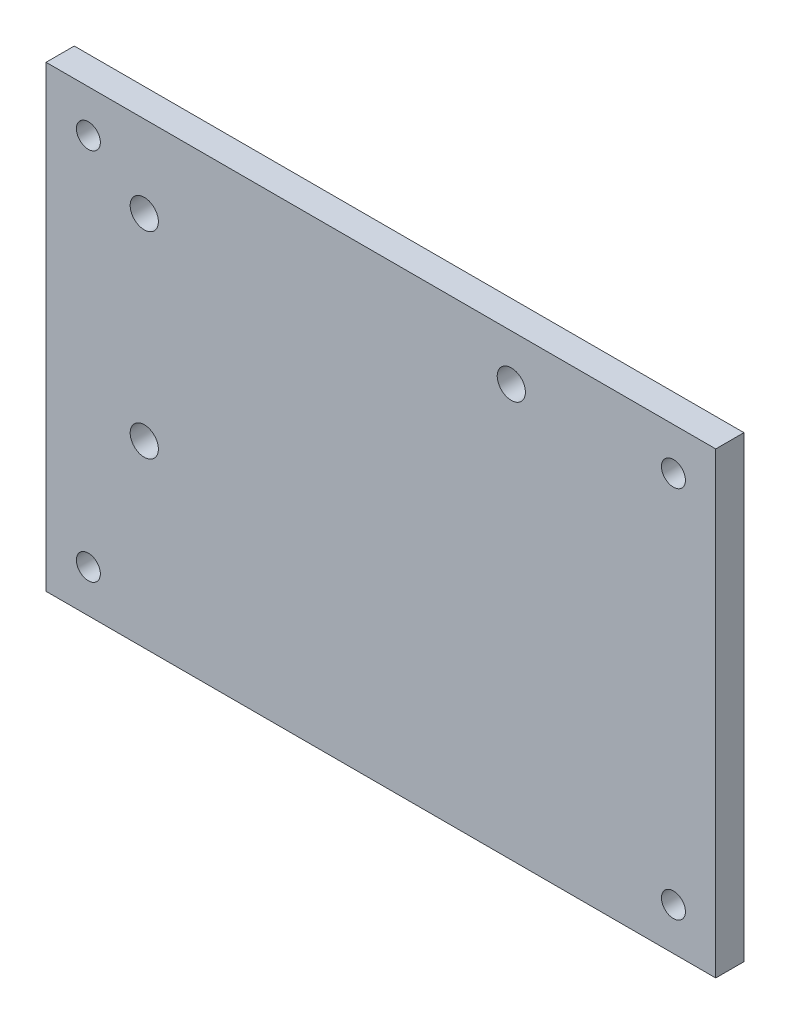
ISO-10303-21;
HEADER;
FILE_DESCRIPTION(('STEP AP214'),'2;1');
FILE_NAME('part.step','',(''),(''),'','','');
FILE_SCHEMA(('AUTOMOTIVE_DESIGN { 1 0 10303 214 1 1 1 1 }'));
ENDSEC;
DATA;
#1=APPLICATION_CONTEXT('core data for automotive mechanical design processes');
#2=APPLICATION_PROTOCOL_DEFINITION('international standard','automotive_design',2000,#1);
#3=PRODUCT_CONTEXT('',#1,'mechanical');
#4=PRODUCT('Part','Part','',(#3));
#5=PRODUCT_RELATED_PRODUCT_CATEGORY('part','',(#4));
#6=PRODUCT_DEFINITION_FORMATION('','',#4);
#7=PRODUCT_DEFINITION_CONTEXT('part definition',#1,'design');
#8=PRODUCT_DEFINITION('design','',#6,#7);
#9=PRODUCT_DEFINITION_SHAPE('','',#8);
#10=(LENGTH_UNIT() NAMED_UNIT(*) SI_UNIT(.MILLI.,.METRE.));
#11=(NAMED_UNIT(*) PLANE_ANGLE_UNIT() SI_UNIT($,.RADIAN.));
#12=(NAMED_UNIT(*) SI_UNIT($,.STERADIAN.) SOLID_ANGLE_UNIT());
#13=UNCERTAINTY_MEASURE_WITH_UNIT(LENGTH_MEASURE(1.E-05),#10,'distance_accuracy_value','');
#14=(GEOMETRIC_REPRESENTATION_CONTEXT(3) GLOBAL_UNCERTAINTY_ASSIGNED_CONTEXT((#13)) GLOBAL_UNIT_ASSIGNED_CONTEXT((#10,
#11,#12)) REPRESENTATION_CONTEXT('',''));
#15=CARTESIAN_POINT('',(0.,0.,0.));
#16=DIRECTION('',(0.,0.,1.));
#17=DIRECTION('',(1.,0.,0.));
#18=AXIS2_PLACEMENT_3D('',#15,#16,#17);
#19=CARTESIAN_POINT('',(-47.5,32.5,4.));
#20=DIRECTION('',(1.,0.,0.));
#21=DIRECTION('',(0.,1.,0.));
#22=AXIS2_PLACEMENT_3D('',#19,#20,#21);
#23=PLANE('',#22);
#24=DIRECTION('',(0.,-1.,0.));
#25=VECTOR('',#24,1.);
#26=CARTESIAN_POINT('',(-47.5,32.5,0.));
#27=LINE('',#26,#25);
#28=CARTESIAN_POINT('',(-47.5,32.5,0.));
#29=VERTEX_POINT('',#28);
#30=CARTESIAN_POINT('',(-47.5,-32.5,0.));
#31=VERTEX_POINT('',#30);
#32=EDGE_CURVE('E101',#29,#31,#27,.T.);
#33=ORIENTED_EDGE('',*,*,#32,.T.);
#34=DIRECTION('',(0.,0.,-1.));
#35=VECTOR('',#34,1.);
#36=CARTESIAN_POINT('',(-47.5,-32.5,4.));
#37=LINE('',#36,#35);
#38=CARTESIAN_POINT('',(-47.5,-32.5,4.));
#39=VERTEX_POINT('',#38);
#40=EDGE_CURVE('E11',#39,#31,#37,.T.);
#41=ORIENTED_EDGE('',*,*,#40,.F.);
#42=DIRECTION('',(0.,-1.,0.));
#43=VECTOR('',#42,1.);
#44=CARTESIAN_POINT('',(-47.5,32.5,4.));
#45=LINE('',#44,#43);
#46=CARTESIAN_POINT('',(-47.5,32.5,4.));
#47=VERTEX_POINT('',#46);
#48=EDGE_CURVE('E89',#47,#39,#45,.T.);
#49=ORIENTED_EDGE('',*,*,#48,.F.);
#50=DIRECTION('',(0.,0.,-1.));
#51=VECTOR('',#50,1.);
#52=CARTESIAN_POINT('',(-47.5,32.5,4.));
#53=LINE('',#52,#51);
#54=EDGE_CURVE('E97',#47,#29,#53,.T.);
#55=ORIENTED_EDGE('',*,*,#54,.T.);
#56=EDGE_LOOP('',(#33,#41,#49,#55));
#57=FACE_BOUND('',#56,.T.);
#58=ADVANCED_FACE('F38',(#57),#23,.F.);
#59=CARTESIAN_POINT('',(-47.5,-32.5,4.));
#60=DIRECTION('',(0.,1.,0.));
#61=DIRECTION('',(-1.,0.,0.));
#62=AXIS2_PLACEMENT_3D('',#59,#60,#61);
#63=PLANE('',#62);
#64=DIRECTION('',(1.,0.,0.));
#65=VECTOR('',#64,1.);
#66=CARTESIAN_POINT('',(-47.5,-32.5,0.));
#67=LINE('',#66,#65);
#68=CARTESIAN_POINT('',(47.5,-32.5,0.));
#69=VERTEX_POINT('',#68);
#70=EDGE_CURVE('E93',#31,#69,#67,.T.);
#71=ORIENTED_EDGE('',*,*,#70,.T.);
#72=DIRECTION('',(0.,0.,-1.));
#73=VECTOR('',#72,1.);
#74=CARTESIAN_POINT('',(47.5,-32.5,4.));
#75=LINE('',#74,#73);
#76=CARTESIAN_POINT('',(47.5,-32.5,4.));
#77=VERTEX_POINT('',#76);
#78=EDGE_CURVE('E46',#77,#69,#75,.T.);
#79=ORIENTED_EDGE('',*,*,#78,.F.);
#80=DIRECTION('',(1.,0.,0.));
#81=VECTOR('',#80,1.);
#82=CARTESIAN_POINT('',(-47.5,-32.5,4.));
#83=LINE('',#82,#81);
#84=EDGE_CURVE('E84',#39,#77,#83,.T.);
#85=ORIENTED_EDGE('',*,*,#84,.F.);
#86=ORIENTED_EDGE('',*,*,#40,.T.);
#87=EDGE_LOOP('',(#71,#79,#85,#86));
#88=FACE_BOUND('',#87,.T.);
#89=ADVANCED_FACE('F92',(#88),#63,.F.);
#90=CARTESIAN_POINT('',(47.5,32.5,4.));
#91=DIRECTION('',(-1.,0.,0.));
#92=DIRECTION('',(0.,0.,1.));
#93=AXIS2_PLACEMENT_3D('',#90,#91,#92);
#94=PLANE('',#93);
#95=DIRECTION('',(0.,1.,0.));
#96=VECTOR('',#95,1.);
#97=CARTESIAN_POINT('',(47.5,32.5,0.));
#98=LINE('',#97,#96);
#99=CARTESIAN_POINT('',(47.5,32.5,0.));
#100=VERTEX_POINT('',#99);
#101=EDGE_CURVE('E71',#69,#100,#98,.T.);
#102=ORIENTED_EDGE('',*,*,#101,.T.);
#103=DIRECTION('',(0.,0.,-1.));
#104=VECTOR('',#103,1.);
#105=CARTESIAN_POINT('',(47.5,32.5,4.));
#106=LINE('',#105,#104);
#107=CARTESIAN_POINT('',(47.5,32.5,4.));
#108=VERTEX_POINT('',#107);
#109=EDGE_CURVE('E94',#108,#100,#106,.T.);
#110=ORIENTED_EDGE('',*,*,#109,.F.);
#111=DIRECTION('',(0.,1.,0.));
#112=VECTOR('',#111,1.);
#113=CARTESIAN_POINT('',(47.5,32.5,4.));
#114=LINE('',#113,#112);
#115=EDGE_CURVE('E87',#77,#108,#114,.T.);
#116=ORIENTED_EDGE('',*,*,#115,.F.);
#117=ORIENTED_EDGE('',*,*,#78,.T.);
#118=EDGE_LOOP('',(#102,#110,#116,#117));
#119=FACE_BOUND('',#118,.T.);
#120=ADVANCED_FACE('F95',(#119),#94,.F.);
#121=CARTESIAN_POINT('',(-47.5,32.5,4.));
#122=DIRECTION('',(0.,-1.,0.));
#123=DIRECTION('',(1.,0.,0.));
#124=AXIS2_PLACEMENT_3D('',#121,#122,#123);
#125=PLANE('',#124);
#126=DIRECTION('',(-1.,0.,0.));
#127=VECTOR('',#126,1.);
#128=CARTESIAN_POINT('',(-47.5,32.5,0.));
#129=LINE('',#128,#127);
#130=EDGE_CURVE('E77',#100,#29,#129,.T.);
#131=ORIENTED_EDGE('',*,*,#130,.T.);
#132=ORIENTED_EDGE('',*,*,#54,.F.);
#133=DIRECTION('',(-1.,0.,0.));
#134=VECTOR('',#133,1.);
#135=CARTESIAN_POINT('',(-47.5,32.5,4.));
#136=LINE('',#135,#134);
#137=EDGE_CURVE('E54',#108,#47,#136,.T.);
#138=ORIENTED_EDGE('',*,*,#137,.F.);
#139=ORIENTED_EDGE('',*,*,#109,.T.);
#140=EDGE_LOOP('',(#131,#132,#138,#139));
#141=FACE_BOUND('',#140,.T.);
#142=ADVANCED_FACE('F109',(#141),#125,.F.);
#143=CARTESIAN_POINT('',(0.,0.,4.));
#144=DIRECTION('',(0.,0.,1.));
#145=DIRECTION('',(1.,0.,0.));
#146=AXIS2_PLACEMENT_3D('',#143,#144,#145);
#147=PLANE('',#146);
#148=CARTESIAN_POINT('',(18.5,25.96,4.));
#149=DIRECTION('',(0.,0.,1.));
#150=DIRECTION('',(1.,0.,0.));
#151=AXIS2_PLACEMENT_3D('',#148,#149,#150);
#152=CIRCLE('',#151,2.00000000000001);
#153=CARTESIAN_POINT('',(20.5,25.96,4.));
#154=VERTEX_POINT('',#153);
#155=EDGE_CURVE('E151',#154,#154,#152,.T.);
#156=ORIENTED_EDGE('',*,*,#155,.F.);
#157=EDGE_LOOP('',(#156));
#158=FACE_BOUND('',#157,.T.);
#159=CARTESIAN_POINT('',(-33.57,20.88,4.));
#160=DIRECTION('',(0.,0.,1.));
#161=DIRECTION('',(1.,0.,0.));
#162=AXIS2_PLACEMENT_3D('',#159,#160,#161);
#163=CIRCLE('',#162,2.);
#164=CARTESIAN_POINT('',(-31.57,20.88,4.));
#165=VERTEX_POINT('',#164);
#166=EDGE_CURVE('E148',#165,#165,#163,.T.);
#167=ORIENTED_EDGE('',*,*,#166,.F.);
#168=EDGE_LOOP('',(#167));
#169=FACE_BOUND('',#168,.T.);
#170=CARTESIAN_POINT('',(-33.57,-7.06000000000003,4.));
#171=DIRECTION('',(0.,0.,1.));
#172=DIRECTION('',(1.,0.,0.));
#173=AXIS2_PLACEMENT_3D('',#170,#171,#172);
#174=CIRCLE('',#173,2.);
#175=CARTESIAN_POINT('',(-31.57,-7.06000000000003,4.));
#176=VERTEX_POINT('',#175);
#177=EDGE_CURVE('E142',#176,#176,#174,.T.);
#178=ORIENTED_EDGE('',*,*,#177,.F.);
#179=EDGE_LOOP('',(#178));
#180=FACE_BOUND('',#179,.T.);
#181=CARTESIAN_POINT('',(41.5,-26.5,4.));
#182=DIRECTION('',(0.,0.,1.));
#183=DIRECTION('',(1.,0.,0.));
#184=AXIS2_PLACEMENT_3D('',#181,#182,#183);
#185=CIRCLE('',#184,1.7);
#186=CARTESIAN_POINT('',(43.2,-26.5,4.));
#187=VERTEX_POINT('',#186);
#188=EDGE_CURVE('E104',#187,#187,#185,.T.);
#189=ORIENTED_EDGE('',*,*,#188,.F.);
#190=EDGE_LOOP('',(#189));
#191=FACE_BOUND('',#190,.T.);
#192=CARTESIAN_POINT('',(-41.5,26.5,4.));
#193=DIRECTION('',(0.,0.,1.));
#194=DIRECTION('',(1.,0.,0.));
#195=AXIS2_PLACEMENT_3D('',#192,#193,#194);
#196=CIRCLE('',#195,1.7);
#197=CARTESIAN_POINT('',(-39.8,26.5,4.));
#198=VERTEX_POINT('',#197);
#199=EDGE_CURVE('E117',#198,#198,#196,.T.);
#200=ORIENTED_EDGE('',*,*,#199,.F.);
#201=EDGE_LOOP('',(#200));
#202=FACE_BOUND('',#201,.T.);
#203=CARTESIAN_POINT('',(-41.5,-26.5,4.));
#204=DIRECTION('',(0.,0.,1.));
#205=DIRECTION('',(1.,0.,0.));
#206=AXIS2_PLACEMENT_3D('',#203,#204,#205);
#207=CIRCLE('',#206,1.7);
#208=CARTESIAN_POINT('',(-39.8,-26.5,4.));
#209=VERTEX_POINT('',#208);
#210=EDGE_CURVE('E120',#209,#209,#207,.T.);
#211=ORIENTED_EDGE('',*,*,#210,.F.);
#212=EDGE_LOOP('',(#211));
#213=FACE_BOUND('',#212,.T.);
#214=CARTESIAN_POINT('',(41.5,26.5,4.));
#215=DIRECTION('',(0.,0.,1.));
#216=DIRECTION('',(1.,0.,0.));
#217=AXIS2_PLACEMENT_3D('',#214,#215,#216);
#218=CIRCLE('',#217,1.7);
#219=CARTESIAN_POINT('',(43.2,26.5,4.));
#220=VERTEX_POINT('',#219);
#221=EDGE_CURVE('E123',#220,#220,#218,.T.);
#222=ORIENTED_EDGE('',*,*,#221,.F.);
#223=EDGE_LOOP('',(#222));
#224=FACE_BOUND('',#223,.T.);
#225=ORIENTED_EDGE('',*,*,#48,.T.);
#226=ORIENTED_EDGE('',*,*,#84,.T.);
#227=ORIENTED_EDGE('',*,*,#115,.T.);
#228=ORIENTED_EDGE('',*,*,#137,.T.);
#229=EDGE_LOOP('',(#225,#226,#227,#228));
#230=FACE_BOUND('',#229,.T.);
#231=ADVANCED_FACE('F85',(#158,#169,#180,#191,#202,#213,#224,#230),#147,.T.);
#232=CARTESIAN_POINT('',(0.,0.,0.));
#233=DIRECTION('',(0.,0.,1.));
#234=DIRECTION('',(1.,0.,0.));
#235=AXIS2_PLACEMENT_3D('',#232,#233,#234);
#236=PLANE('',#235);
#237=CARTESIAN_POINT('',(41.5,-26.5,0.));
#238=DIRECTION('',(0.,0.,-1.));
#239=DIRECTION('',(1.,0.,0.));
#240=AXIS2_PLACEMENT_3D('',#237,#238,#239);
#241=CIRCLE('',#240,1.7);
#242=CARTESIAN_POINT('',(43.2,-26.5,0.));
#243=VERTEX_POINT('',#242);
#244=EDGE_CURVE('E129',#243,#243,#241,.T.);
#245=ORIENTED_EDGE('',*,*,#244,.F.);
#246=EDGE_LOOP('',(#245));
#247=FACE_BOUND('',#246,.T.);
#248=CARTESIAN_POINT('',(-41.5,26.5,0.));
#249=DIRECTION('',(0.,0.,-1.));
#250=DIRECTION('',(1.,0.,0.));
#251=AXIS2_PLACEMENT_3D('',#248,#249,#250);
#252=CIRCLE('',#251,1.7);
#253=CARTESIAN_POINT('',(-39.8,26.5,0.));
#254=VERTEX_POINT('',#253);
#255=EDGE_CURVE('E130',#254,#254,#252,.T.);
#256=ORIENTED_EDGE('',*,*,#255,.F.);
#257=EDGE_LOOP('',(#256));
#258=FACE_BOUND('',#257,.T.);
#259=CARTESIAN_POINT('',(-41.5,-26.5,0.));
#260=DIRECTION('',(0.,0.,-1.));
#261=DIRECTION('',(-1.,0.,0.));
#262=AXIS2_PLACEMENT_3D('',#259,#260,#261);
#263=CIRCLE('',#262,1.7);
#264=CARTESIAN_POINT('',(-43.2,-26.5,0.));
#265=VERTEX_POINT('',#264);
#266=EDGE_CURVE('E133',#265,#265,#263,.T.);
#267=ORIENTED_EDGE('',*,*,#266,.F.);
#268=EDGE_LOOP('',(#267));
#269=FACE_BOUND('',#268,.T.);
#270=CARTESIAN_POINT('',(41.5,26.5,0.));
#271=DIRECTION('',(0.,0.,-1.));
#272=DIRECTION('',(-1.,0.,0.));
#273=AXIS2_PLACEMENT_3D('',#270,#271,#272);
#274=CIRCLE('',#273,1.7);
#275=CARTESIAN_POINT('',(39.8,26.5,0.));
#276=VERTEX_POINT('',#275);
#277=EDGE_CURVE('E126',#276,#276,#274,.T.);
#278=ORIENTED_EDGE('',*,*,#277,.F.);
#279=EDGE_LOOP('',(#278));
#280=FACE_BOUND('',#279,.T.);
#281=ORIENTED_EDGE('',*,*,#32,.F.);
#282=ORIENTED_EDGE('',*,*,#130,.F.);
#283=ORIENTED_EDGE('',*,*,#101,.F.);
#284=ORIENTED_EDGE('',*,*,#70,.F.);
#285=EDGE_LOOP('',(#281,#282,#283,#284));
#286=FACE_BOUND('',#285,.T.);
#287=ADVANCED_FACE('F112',(#247,#258,#269,#280,#286),#236,.F.);
#288=CARTESIAN_POINT('',(41.5,26.5,5.));
#289=DIRECTION('',(0.,0.,-1.));
#290=DIRECTION('',(-1.,0.,0.));
#291=AXIS2_PLACEMENT_3D('',#288,#289,#290);
#292=CYLINDRICAL_SURFACE('',#291,1.7);
#293=ORIENTED_EDGE('',*,*,#221,.T.);
#294=EDGE_LOOP('',(#293));
#295=FACE_BOUND('',#294,.T.);
#296=ORIENTED_EDGE('',*,*,#277,.T.);
#297=EDGE_LOOP('',(#296));
#298=FACE_BOUND('',#297,.T.);
#299=ADVANCED_FACE('F181',(#295,#298),#292,.F.);
#300=CARTESIAN_POINT('',(-41.5,-26.5,5.));
#301=DIRECTION('',(0.,0.,-1.));
#302=DIRECTION('',(-1.,0.,0.));
#303=AXIS2_PLACEMENT_3D('',#300,#301,#302);
#304=CYLINDRICAL_SURFACE('',#303,1.7);
#305=ORIENTED_EDGE('',*,*,#210,.T.);
#306=EDGE_LOOP('',(#305));
#307=FACE_BOUND('',#306,.T.);
#308=ORIENTED_EDGE('',*,*,#266,.T.);
#309=EDGE_LOOP('',(#308));
#310=FACE_BOUND('',#309,.T.);
#311=ADVANCED_FACE('F184',(#307,#310),#304,.F.);
#312=CARTESIAN_POINT('',(-41.5,26.5,5.));
#313=DIRECTION('',(0.,0.,-1.));
#314=DIRECTION('',(-1.,0.,0.));
#315=AXIS2_PLACEMENT_3D('',#312,#313,#314);
#316=CYLINDRICAL_SURFACE('',#315,1.7);
#317=ORIENTED_EDGE('',*,*,#199,.T.);
#318=EDGE_LOOP('',(#317));
#319=FACE_BOUND('',#318,.T.);
#320=ORIENTED_EDGE('',*,*,#255,.T.);
#321=EDGE_LOOP('',(#320));
#322=FACE_BOUND('',#321,.T.);
#323=ADVANCED_FACE('F293',(#319,#322),#316,.F.);
#324=CARTESIAN_POINT('',(41.5,-26.5,5.));
#325=DIRECTION('',(0.,0.,-1.));
#326=DIRECTION('',(-1.,0.,0.));
#327=AXIS2_PLACEMENT_3D('',#324,#325,#326);
#328=CYLINDRICAL_SURFACE('',#327,1.7);
#329=ORIENTED_EDGE('',*,*,#188,.T.);
#330=EDGE_LOOP('',(#329));
#331=FACE_BOUND('',#330,.T.);
#332=ORIENTED_EDGE('',*,*,#244,.T.);
#333=EDGE_LOOP('',(#332));
#334=FACE_BOUND('',#333,.T.);
#335=ADVANCED_FACE('F221',(#331,#334),#328,.F.);
#336=CARTESIAN_POINT('',(-33.57,-7.06000000000003,1.));
#337=DIRECTION('',(0.,0.,1.));
#338=DIRECTION('',(1.,0.,0.));
#339=AXIS2_PLACEMENT_3D('',#336,#337,#338);
#340=CYLINDRICAL_SURFACE('',#339,2.);
#341=CARTESIAN_POINT('',(-33.57,-7.06000000000003,1.));
#342=DIRECTION('',(0.,0.,1.));
#343=DIRECTION('',(1.,0.,0.));
#344=AXIS2_PLACEMENT_3D('',#341,#342,#343);
#345=CIRCLE('',#344,2.);
#346=CARTESIAN_POINT('',(-31.57,-7.06000000000003,1.));
#347=VERTEX_POINT('',#346);
#348=EDGE_CURVE('E139',#347,#347,#345,.T.);
#349=ORIENTED_EDGE('',*,*,#348,.F.);
#350=EDGE_LOOP('',(#349));
#351=FACE_BOUND('',#350,.T.);
#352=ORIENTED_EDGE('',*,*,#177,.T.);
#353=EDGE_LOOP('',(#352));
#354=FACE_BOUND('',#353,.T.);
#355=ADVANCED_FACE('F226',(#351,#354),#340,.F.);
#356=CARTESIAN_POINT('',(-33.57,-7.06000000000003,1.));
#357=DIRECTION('',(0.,0.,1.));
#358=DIRECTION('',(1.,0.,0.));
#359=AXIS2_PLACEMENT_3D('',#356,#357,#358);
#360=PLANE('',#359);
#361=ORIENTED_EDGE('',*,*,#348,.T.);
#362=EDGE_LOOP('',(#361));
#363=FACE_BOUND('',#362,.T.);
#364=ADVANCED_FACE('F231',(#363),#360,.T.);
#365=CARTESIAN_POINT('',(-33.57,20.88,1.));
#366=DIRECTION('',(0.,0.,1.));
#367=DIRECTION('',(1.,0.,0.));
#368=AXIS2_PLACEMENT_3D('',#365,#366,#367);
#369=CYLINDRICAL_SURFACE('',#368,2.);
#370=CARTESIAN_POINT('',(-33.57,20.88,1.));
#371=DIRECTION('',(0.,0.,1.));
#372=DIRECTION('',(1.,0.,0.));
#373=AXIS2_PLACEMENT_3D('',#370,#371,#372);
#374=CIRCLE('',#373,2.);
#375=CARTESIAN_POINT('',(-31.57,20.88,1.));
#376=VERTEX_POINT('',#375);
#377=EDGE_CURVE('E145',#376,#376,#374,.T.);
#378=ORIENTED_EDGE('',*,*,#377,.F.);
#379=EDGE_LOOP('',(#378));
#380=FACE_BOUND('',#379,.T.);
#381=ORIENTED_EDGE('',*,*,#166,.T.);
#382=EDGE_LOOP('',(#381));
#383=FACE_BOUND('',#382,.T.);
#384=ADVANCED_FACE('F242',(#380,#383),#369,.F.);
#385=CARTESIAN_POINT('',(-33.57,20.88,1.));
#386=DIRECTION('',(0.,0.,1.));
#387=DIRECTION('',(1.,0.,0.));
#388=AXIS2_PLACEMENT_3D('',#385,#386,#387);
#389=PLANE('',#388);
#390=ORIENTED_EDGE('',*,*,#377,.T.);
#391=EDGE_LOOP('',(#390));
#392=FACE_BOUND('',#391,.T.);
#393=ADVANCED_FACE('F162',(#392),#389,.T.);
#394=CARTESIAN_POINT('',(18.5,25.96,1.));
#395=DIRECTION('',(0.,0.,1.));
#396=DIRECTION('',(1.,0.,0.));
#397=AXIS2_PLACEMENT_3D('',#394,#395,#396);
#398=CYLINDRICAL_SURFACE('',#397,2.00000000000001);
#399=CARTESIAN_POINT('',(18.5,25.96,1.));
#400=DIRECTION('',(0.,0.,1.));
#401=DIRECTION('',(1.,0.,0.));
#402=AXIS2_PLACEMENT_3D('',#399,#400,#401);
#403=CIRCLE('',#402,2.00000000000001);
#404=CARTESIAN_POINT('',(20.5,25.96,1.));
#405=VERTEX_POINT('',#404);
#406=EDGE_CURVE('E138',#405,#405,#403,.T.);
#407=ORIENTED_EDGE('',*,*,#406,.F.);
#408=EDGE_LOOP('',(#407));
#409=FACE_BOUND('',#408,.T.);
#410=ORIENTED_EDGE('',*,*,#155,.T.);
#411=EDGE_LOOP('',(#410));
#412=FACE_BOUND('',#411,.T.);
#413=ADVANCED_FACE('F159',(#409,#412),#398,.F.);
#414=CARTESIAN_POINT('',(18.5,25.96,1.));
#415=DIRECTION('',(0.,0.,1.));
#416=DIRECTION('',(1.,0.,0.));
#417=AXIS2_PLACEMENT_3D('',#414,#415,#416);
#418=PLANE('',#417);
#419=ORIENTED_EDGE('',*,*,#406,.T.);
#420=EDGE_LOOP('',(#419));
#421=FACE_BOUND('',#420,.T.);
#422=ADVANCED_FACE('F157',(#421),#418,.T.);
#423=CLOSED_SHELL('',(#58,#89,#120,#142,#231,#287,#299,#311,#323,#335,#355,#364,#384,#393,#413,#422));
#424=MANIFOLD_SOLID_BREP('B2',#423);
#425=ADVANCED_BREP_SHAPE_REPRESENTATION('',(#18,#424),#14);
#426=SHAPE_DEFINITION_REPRESENTATION(#9,#425);
ENDSEC;
END-ISO-10303-21;
